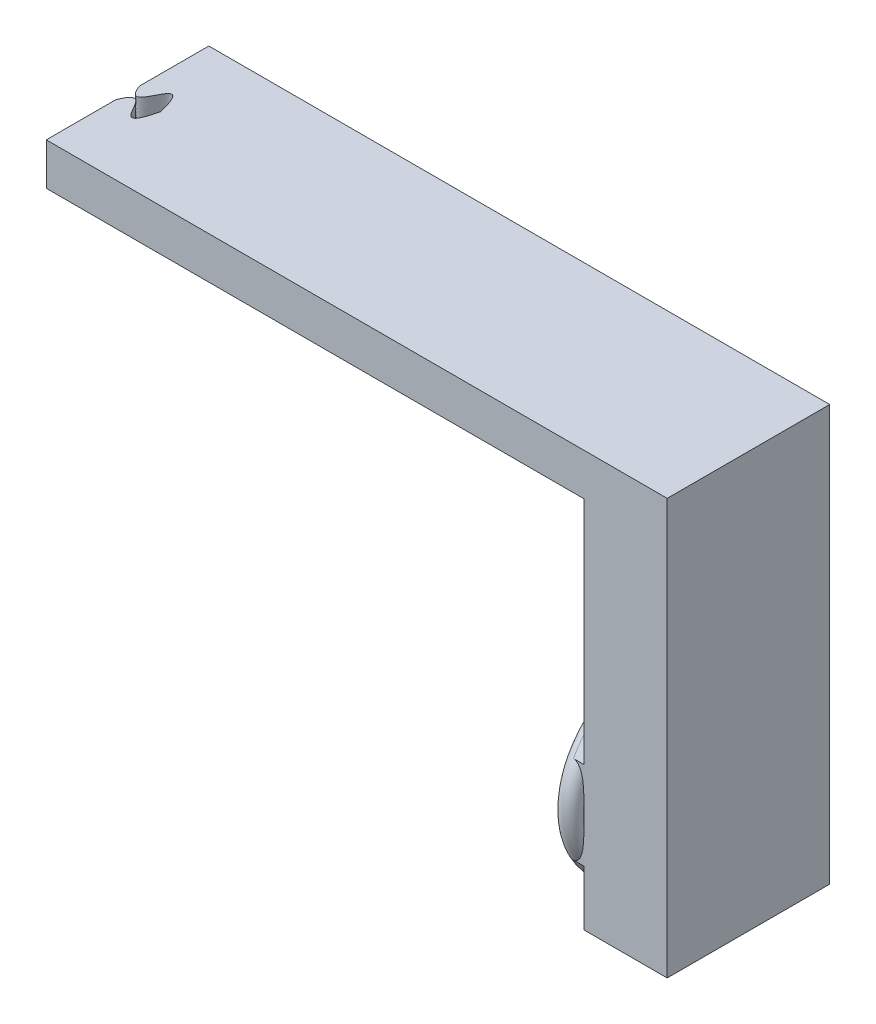
ISO-10303-21;
HEADER;
FILE_DESCRIPTION(('STEP AP214'),'2;1');
FILE_NAME('part.step','',(''),(''),'','','');
FILE_SCHEMA(('AUTOMOTIVE_DESIGN { 1 0 10303 214 1 1 1 1 }'));
ENDSEC;
DATA;
#1=APPLICATION_CONTEXT('core data for automotive mechanical design processes');
#2=APPLICATION_PROTOCOL_DEFINITION('international standard','automotive_design',2000,#1);
#3=PRODUCT_CONTEXT('',#1,'mechanical');
#4=PRODUCT('Part','Part','',(#3));
#5=PRODUCT_RELATED_PRODUCT_CATEGORY('part','',(#4));
#6=PRODUCT_DEFINITION_FORMATION('','',#4);
#7=PRODUCT_DEFINITION_CONTEXT('part definition',#1,'design');
#8=PRODUCT_DEFINITION('design','',#6,#7);
#9=PRODUCT_DEFINITION_SHAPE('','',#8);
#10=(LENGTH_UNIT() NAMED_UNIT(*) SI_UNIT(.MILLI.,.METRE.));
#11=(NAMED_UNIT(*) PLANE_ANGLE_UNIT() SI_UNIT($,.RADIAN.));
#12=(NAMED_UNIT(*) SI_UNIT($,.STERADIAN.) SOLID_ANGLE_UNIT());
#13=UNCERTAINTY_MEASURE_WITH_UNIT(LENGTH_MEASURE(1.E-05),#10,'distance_accuracy_value','');
#14=(GEOMETRIC_REPRESENTATION_CONTEXT(3) GLOBAL_UNCERTAINTY_ASSIGNED_CONTEXT((#13)) GLOBAL_UNIT_ASSIGNED_CONTEXT((#10,
#11,#12)) REPRESENTATION_CONTEXT('',''));
#15=CARTESIAN_POINT('',(0.,0.,0.));
#16=DIRECTION('',(0.,0.,1.));
#17=DIRECTION('',(1.,0.,0.));
#18=AXIS2_PLACEMENT_3D('',#15,#16,#17);
#19=CARTESIAN_POINT('',(122.99867768057,-65.278,-19.3474854195136));
#20=DIRECTION('',(1.,0.,0.));
#21=DIRECTION('',(0.,0.,-1.));
#22=AXIS2_PLACEMENT_3D('',#19,#20,#21);
#23=CYLINDRICAL_SURFACE('',#22,22.);
#24=CARTESIAN_POINT('',(125.49867768057,-65.278,-19.3474854195136));
#25=DIRECTION('',(-1.,0.,0.));
#26=DIRECTION('',(0.,0.,1.));
#27=AXIS2_PLACEMENT_3D('',#24,#25,#26);
#28=CIRCLE('',#27,22.);
#29=CARTESIAN_POINT('',(125.49867768057,-75.7505740838491,0.));
#30=VERTEX_POINT('',#29);
#31=CARTESIAN_POINT('',(125.49867768057,-75.7505740838491,-38.6949708390272));
#32=VERTEX_POINT('',#31);
#33=EDGE_CURVE('E317',#30,#32,#28,.F.);
#34=ORIENTED_EDGE('',*,*,#33,.T.);
#35=DIRECTION('',(1.,0.,0.));
#36=VECTOR('',#35,1.);
#37=CARTESIAN_POINT('',(125.49867768057,-75.7505740838491,-38.6949708390272));
#38=LINE('',#37,#36);
#39=CARTESIAN_POINT('',(127.99867768057,-75.7505740838491,-38.6949708390272));
#40=VERTEX_POINT('',#39);
#41=EDGE_CURVE('E238',#32,#40,#38,.T.);
#42=ORIENTED_EDGE('',*,*,#41,.T.);
#43=CARTESIAN_POINT('',(127.99867768057,-65.278,-19.3474854195136));
#44=DIRECTION('',(1.,0.,0.));
#45=DIRECTION('',(0.,0.,-1.));
#46=AXIS2_PLACEMENT_3D('',#43,#44,#45);
#47=CIRCLE('',#46,22.);
#48=CARTESIAN_POINT('',(127.99867768057,-75.7505740838491,0.));
#49=VERTEX_POINT('',#48);
#50=EDGE_CURVE('E372',#40,#49,#47,.F.);
#51=ORIENTED_EDGE('',*,*,#50,.T.);
#52=DIRECTION('',(1.,0.,0.));
#53=VECTOR('',#52,1.);
#54=CARTESIAN_POINT('',(122.99867768057,-75.7505740838491,0.));
#55=LINE('',#54,#53);
#56=EDGE_CURVE('E320',#49,#30,#55,.F.);
#57=ORIENTED_EDGE('',*,*,#56,.T.);
#58=EDGE_LOOP('',(#34,#42,#51,#57));
#59=FACE_BOUND('',#58,.T.);
#60=ADVANCED_FACE('F35',(#59),#23,.T.);
#61=CARTESIAN_POINT('',(125.49867768057,-65.278,-19.3474854195136));
#62=DIRECTION('',(-1.,0.,0.));
#63=DIRECTION('',(0.,0.,1.));
#64=AXIS2_PLACEMENT_3D('',#61,#62,#63);
#65=TOROIDAL_SURFACE('',#64,19.5,2.50000000000001);
#66=CARTESIAN_POINT('',(122.99867768057,-65.278,-19.3474854195136));
#67=DIRECTION('',(-1.,0.,0.));
#68=DIRECTION('',(0.,0.,1.));
#69=AXIS2_PLACEMENT_3D('',#66,#67,#68);
#70=CIRCLE('',#69,19.5);
#71=CARTESIAN_POINT('',(122.99867768057,-65.278,0.152514580486374));
#72=VERTEX_POINT('',#71);
#73=EDGE_CURVE('E332',#72,#72,#70,.T.);
#74=ORIENTED_EDGE('',*,*,#73,.F.);
#75=EDGE_LOOP('',(#74));
#76=FACE_BOUND('',#75,.T.);
#77=CARTESIAN_POINT('',(127.99867768057,-67.7120928375285,0.));
#78=CARTESIAN_POINT('',(127.998653875089,-67.9150415597241,0.));
#79=CARTESIAN_POINT('',(127.998291756496,-68.1179952993419,0.));
#80=CARTESIAN_POINT('',(127.996150881221,-68.5239263347357,0.));
#81=CARTESIAN_POINT('',(127.994371901966,-68.7269036292026,0.));
#82=CARTESIAN_POINT('',(127.98864102688,-69.1339543891392,0.));
#83=CARTESIAN_POINT('',(127.984677164041,-69.3380277064403,0.));
#84=CARTESIAN_POINT('',(127.973638455801,-69.7460832746379,0.));
#85=CARTESIAN_POINT('',(127.966563786721,-69.9500655300399,0.));
#86=CARTESIAN_POINT('',(127.947739638931,-70.3686750733143,0.));
#87=CARTESIAN_POINT('',(127.935761919262,-70.5832925844783,0.));
#88=CARTESIAN_POINT('',(127.905675866098,-71.0120938799854,0.));
#89=CARTESIAN_POINT('',(127.887568106465,-71.2262777030407,0.));
#90=CARTESIAN_POINT('',(127.843482552317,-71.6533605381168,0.));
#91=CARTESIAN_POINT('',(127.817522817748,-71.8662613669498,0.));
#92=CARTESIAN_POINT('',(127.755547244861,-72.2905685407659,0.));
#93=CARTESIAN_POINT('',(127.719535134195,-72.5019754100053,0.));
#94=CARTESIAN_POINT('',(127.647207862933,-72.8600822586272,0.));
#95=CARTESIAN_POINT('',(127.614130776684,-73.007432034874,0.));
#96=CARTESIAN_POINT('',(127.540336247468,-73.3003183086709,0.));
#97=CARTESIAN_POINT('',(127.499614843539,-73.4458538242689,0.));
#98=CARTESIAN_POINT('',(127.40943877384,-73.73272579543,0.));
#99=CARTESIAN_POINT('',(127.360069958055,-73.8740888871132,0.));
#100=CARTESIAN_POINT('',(127.250490719176,-74.1524902276336,0.));
#101=CARTESIAN_POINT('',(127.1902902972,-74.2895323301195,0.));
#102=CARTESIAN_POINT('',(127.067337109229,-74.5355576574483,0.));
#103=CARTESIAN_POINT('',(127.006548391876,-74.6455114548854,0.));
#104=CARTESIAN_POINT('',(126.873595270829,-74.8588601007675,0.));
#105=CARTESIAN_POINT('',(126.801401458554,-74.9622369960858,0.));
#106=CARTESIAN_POINT('',(126.642661111286,-75.1597761133722,0.));
#107=CARTESIAN_POINT('',(126.555939831606,-75.253800730244,0.));
#108=CARTESIAN_POINT('',(126.366939703951,-75.4246246211576,0.));
#109=CARTESIAN_POINT('',(126.264733806815,-75.5015006929473,0.));
#110=CARTESIAN_POINT('',(126.091146127673,-75.6020871227989,0.));
#111=CARTESIAN_POINT('',(126.024848187066,-75.6345659654067,0.));
#112=CARTESIAN_POINT('',(125.887915704172,-75.6884599040057,0.));
#113=CARTESIAN_POINT('',(125.817290872627,-75.7098988273357,0.));
#114=CARTESIAN_POINT('',(125.709299324383,-75.7324512271571,0.));
#115=CARTESIAN_POINT('',(125.672889661776,-75.7383697164854,0.));
#116=CARTESIAN_POINT('',(125.599670085356,-75.7468513411134,0.));
#117=CARTESIAN_POINT('',(125.562860168975,-75.7494144548812,0.));
#118=CARTESIAN_POINT('',(125.488820831862,-75.7511137235701,0.));
#119=CARTESIAN_POINT('',(125.451590693735,-75.7502177820609,0.));
#120=CARTESIAN_POINT('',(125.377360999609,-75.7449704281656,0.));
#121=CARTESIAN_POINT('',(125.340361530857,-75.7406177798349,0.));
#122=CARTESIAN_POINT('',(125.303645281954,-75.7345588957656,0.));
#123=B_SPLINE_CURVE_WITH_KNOTS('',3,(#77,#78,#79,#80,#81,#82,#83,#84,#85,#86,#87,#88,#89,#90,
#91,#92,#93,#94,#95,#96,#97,#98,#99,#100,#101,#102,#103,#104,#105,#106,#107,#108,#109,#110,#111,
#112,#113,#114,#115,#116,#117,#118,#119,#120,#121,#122),.UNSPECIFIED.,.F.,.F.,(4,2,2,2,2,2,2,2,
2,2,2,2,2,2,2,2,2,2,2,2,2,2,4),(0.,0.608853777534797,1.21780321725812,1.83012161295994,
2.442405307144,3.08719445794953,3.73192326359535,4.37518029298062,5.01819910394352,
5.47108862725286,5.92421346974392,6.37307134585034,6.82151688633855,7.19791275577215,
7.57529551632987,7.95759514581978,8.3381466936341,8.55886071683672,8.77909635743805,
8.88962879393999,9.00016193973422,9.1117231719602,9.22332431084367),.UNSPECIFIED.);
#124=CARTESIAN_POINT('',(127.99867768057,-67.7120928375285,0.));
#125=VERTEX_POINT('',#124);
#126=EDGE_CURVE('E241',#125,#30,#123,.T.);
#127=ORIENTED_EDGE('',*,*,#126,.F.);
#128=CARTESIAN_POINT('',(127.99867768057,-65.278,-19.3474854195136));
#129=DIRECTION('',(-1.,0.,0.));
#130=DIRECTION('',(0.,0.,1.));
#131=AXIS2_PLACEMENT_3D('',#128,#129,#130);
#132=CIRCLE('',#131,19.5);
#133=CARTESIAN_POINT('',(127.99867768057,-62.8439071624715,0.));
#134=VERTEX_POINT('',#133);
#135=EDGE_CURVE('E330',#134,#125,#132,.F.);
#136=ORIENTED_EDGE('',*,*,#135,.F.);
#137=CARTESIAN_POINT('',(127.99867768057,-62.8439071624715,0.));
#138=CARTESIAN_POINT('',(127.998653875089,-62.6409584402759,0.));
#139=CARTESIAN_POINT('',(127.998291756496,-62.4380047006581,0.));
#140=CARTESIAN_POINT('',(127.996150881221,-62.0320736652643,0.));
#141=CARTESIAN_POINT('',(127.994371901966,-61.8290963707974,0.));
#142=CARTESIAN_POINT('',(127.98864102688,-61.4220456108608,0.));
#143=CARTESIAN_POINT('',(127.984677164041,-61.2179722935597,0.));
#144=CARTESIAN_POINT('',(127.973638455801,-60.8099167253621,0.));
#145=CARTESIAN_POINT('',(127.966563786721,-60.6059344699601,0.));
#146=CARTESIAN_POINT('',(127.947739638931,-60.1873249266857,0.));
#147=CARTESIAN_POINT('',(127.935761919262,-59.9727074155216,0.));
#148=CARTESIAN_POINT('',(127.905675866098,-59.5439061200146,0.));
#149=CARTESIAN_POINT('',(127.887568106465,-59.3297222969593,0.));
#150=CARTESIAN_POINT('',(127.843482552317,-58.9026394618831,0.));
#151=CARTESIAN_POINT('',(127.817522817748,-58.6897386330502,0.));
#152=CARTESIAN_POINT('',(127.755547244861,-58.2654314592341,0.));
#153=CARTESIAN_POINT('',(127.719535134195,-58.0540245899947,0.));
#154=CARTESIAN_POINT('',(127.647207862933,-57.6959177413727,0.));
#155=CARTESIAN_POINT('',(127.614130776684,-57.548567965126,0.));
#156=CARTESIAN_POINT('',(127.540336247468,-57.2556816913291,0.));
#157=CARTESIAN_POINT('',(127.499614843539,-57.1101461757311,0.));
#158=CARTESIAN_POINT('',(127.40943877384,-56.82327420457,0.));
#159=CARTESIAN_POINT('',(127.360069958055,-56.6819111128868,0.));
#160=CARTESIAN_POINT('',(127.250490719176,-56.4035097723663,0.));
#161=CARTESIAN_POINT('',(127.1902902972,-56.2664676698805,0.));
#162=CARTESIAN_POINT('',(127.067337109229,-56.0204423425517,0.));
#163=CARTESIAN_POINT('',(127.006548391876,-55.9104885451145,0.));
#164=CARTESIAN_POINT('',(126.873595270829,-55.6971398992325,0.));
#165=CARTESIAN_POINT('',(126.801401458554,-55.5937630039142,0.));
#166=CARTESIAN_POINT('',(126.642661111286,-55.3962238866277,0.));
#167=CARTESIAN_POINT('',(126.555939831606,-55.3021992697559,0.));
#168=CARTESIAN_POINT('',(126.366939703951,-55.1313753788423,0.));
#169=CARTESIAN_POINT('',(126.264733806815,-55.0544993070527,0.));
#170=CARTESIAN_POINT('',(126.091146127673,-54.9539128772011,0.));
#171=CARTESIAN_POINT('',(126.024848187066,-54.9214340345932,0.));
#172=CARTESIAN_POINT('',(125.887915704172,-54.8675400959942,0.));
#173=CARTESIAN_POINT('',(125.817290872627,-54.8461011726643,0.));
#174=CARTESIAN_POINT('',(125.709299324383,-54.8235487728429,0.));
#175=CARTESIAN_POINT('',(125.672889661776,-54.8176302835145,0.));
#176=CARTESIAN_POINT('',(125.599670085356,-54.8091486588866,0.));
#177=CARTESIAN_POINT('',(125.562860168975,-54.8065855451188,0.));
#178=CARTESIAN_POINT('',(125.488820831862,-54.8048862764299,0.));
#179=CARTESIAN_POINT('',(125.451590693735,-54.8057822179391,0.));
#180=CARTESIAN_POINT('',(125.377360999609,-54.8110295718344,0.));
#181=CARTESIAN_POINT('',(125.340361530857,-54.815382220165,0.));
#182=CARTESIAN_POINT('',(125.303645281954,-54.8214411042344,0.));
#183=B_SPLINE_CURVE_WITH_KNOTS('',3,(#137,#138,#139,#140,#141,#142,#143,#144,#145,#146,#147,
#148,#149,#150,#151,#152,#153,#154,#155,#156,#157,#158,#159,#160,#161,#162,#163,#164,#165,#166,
#167,#168,#169,#170,#171,#172,#173,#174,#175,#176,#177,#178,#179,#180,#181,#182),.UNSPECIFIED.,
.F.,.F.,(4,2,2,2,2,2,2,2,2,2,2,2,2,2,2,2,2,2,2,2,2,2,4),(0.,0.608853777534783,1.2178032172581,
1.83012161295994,2.44240530714399,3.08719445794953,3.73192326359537,4.37518029298064,
5.01819910394352,5.47108862725284,5.92421346974392,6.37307134585034,6.82151688633855,
7.19791275577218,7.5752955163299,7.95759514581982,8.33814669363414,8.55886071683678,
8.77909635743809,8.88962879394004,9.00016193973427,9.11172317196024,9.22332431084372),.UNSPECIFIED.);
#184=CARTESIAN_POINT('',(125.49867768057,-54.8054259161509,0.));
#185=VERTEX_POINT('',#184);
#186=EDGE_CURVE('E246',#185,#134,#183,.F.);
#187=ORIENTED_EDGE('',*,*,#186,.F.);
#188=CARTESIAN_POINT('',(125.49867768057,-54.8054259161509,-38.6949708390272));
#189=VERTEX_POINT('',#188);
#190=EDGE_CURVE('E318',#189,#185,#28,.F.);
#191=ORIENTED_EDGE('',*,*,#190,.F.);
#192=EDGE_CURVE('E314',#32,#189,#28,.F.);
#193=ORIENTED_EDGE('',*,*,#192,.F.);
#194=ORIENTED_EDGE('',*,*,#33,.F.);
#195=EDGE_LOOP('',(#127,#136,#187,#191,#193,#194));
#196=FACE_BOUND('',#195,.T.);
#197=ADVANCED_FACE('F254',(#76,#196),#65,.T.);
#198=CARTESIAN_POINT('',(127.99867768057,-88.9,-38.6949708390272));
#199=DIRECTION('',(1.,0.,0.));
#200=DIRECTION('',(0.,0.,-1.));
#201=AXIS2_PLACEMENT_3D('',#198,#199,#200);
#202=PLANE('',#201);
#203=ORIENTED_EDGE('',*,*,#50,.F.);
#204=DIRECTION('',(0.,1.,0.));
#205=VECTOR('',#204,1.);
#206=CARTESIAN_POINT('',(127.99867768057,-88.9,-38.6949708390272));
#207=LINE('',#206,#205);
#208=CARTESIAN_POINT('',(127.99867768057,-88.9,-38.6949708390272));
#209=VERTEX_POINT('',#208);
#210=EDGE_CURVE('E184',#209,#40,#207,.T.);
#211=ORIENTED_EDGE('',*,*,#210,.F.);
#212=DIRECTION('',(0.,0.,-1.));
#213=VECTOR('',#212,1.);
#214=CARTESIAN_POINT('',(127.99867768057,-88.9,-38.6949708390272));
#215=LINE('',#214,#213);
#216=CARTESIAN_POINT('',(127.99867768057,-88.9,0.));
#217=VERTEX_POINT('',#216);
#218=EDGE_CURVE('E167',#217,#209,#215,.T.);
#219=ORIENTED_EDGE('',*,*,#218,.F.);
#220=DIRECTION('',(0.,1.,0.));
#221=VECTOR('',#220,1.);
#222=CARTESIAN_POINT('',(127.99867768057,-88.9,0.));
#223=LINE('',#222,#221);
#224=EDGE_CURVE('E164',#217,#49,#223,.T.);
#225=ORIENTED_EDGE('',*,*,#224,.T.);
#226=EDGE_LOOP('',(#203,#211,#219,#225));
#227=FACE_BOUND('',#226,.T.);
#228=ADVANCED_FACE('F259',(#227),#202,.F.);
#229=CARTESIAN_POINT('',(4.03479205143796,0.,-16.5536165521471));
#230=DIRECTION('',(0.,1.,0.));
#231=DIRECTION('',(0.,0.,1.));
#232=AXIS2_PLACEMENT_3D('',#229,#230,#231);
#233=PLANE('',#232);
#234=DIRECTION('',(0.,0.,-1.));
#235=VECTOR('',#234,1.);
#236=CARTESIAN_POINT('',(127.99867768057,0.,-38.6949708390272));
#237=LINE('',#236,#235);
#238=CARTESIAN_POINT('',(127.99867768057,0.,0.));
#239=VERTEX_POINT('',#238);
#240=CARTESIAN_POINT('',(127.99867768057,0.,-38.6949708390272));
#241=VERTEX_POINT('',#240);
#242=EDGE_CURVE('E173',#239,#241,#237,.T.);
#243=ORIENTED_EDGE('',*,*,#242,.F.);
#244=DIRECTION('',(1.,0.,0.));
#245=VECTOR('',#244,1.);
#246=CARTESIAN_POINT('',(0.,0.,0.));
#247=LINE('',#246,#245);
#248=CARTESIAN_POINT('',(0.,0.,0.));
#249=VERTEX_POINT('',#248);
#250=EDGE_CURVE('E335',#249,#239,#247,.T.);
#251=ORIENTED_EDGE('',*,*,#250,.F.);
#252=DIRECTION('',(0.,0.,1.));
#253=VECTOR('',#252,1.);
#254=CARTESIAN_POINT('',(0.,0.,0.));
#255=LINE('',#254,#253);
#256=CARTESIAN_POINT('',(0.,0.,-16.5121344341374));
#257=VERTEX_POINT('',#256);
#258=EDGE_CURVE('E190',#257,#249,#255,.T.);
#259=ORIENTED_EDGE('',*,*,#258,.F.);
#260=CARTESIAN_POINT('',(7.81240542852166,0.,-19.3474854195136));
#261=CARTESIAN_POINT('',(4.76655386816981,0.,-6.63526012811717));
#262=CARTESIAN_POINT('',(3.38875645949087,0.,-25.5545107263915));
#263=CARTESIAN_POINT('',(0.,0.,-16.5121344341374));
#264=B_SPLINE_CURVE_WITH_KNOTS('',3,(#260,#261,#262,#263),.UNSPECIFIED.,.F.,.F.,(4,4),(0.,1.),.UNSPECIFIED.);
#265=CARTESIAN_POINT('',(7.81240542852166,0.,-19.3474854195136));
#266=VERTEX_POINT('',#265);
#267=EDGE_CURVE('E196',#266,#257,#264,.T.);
#268=ORIENTED_EDGE('',*,*,#267,.F.);
#269=CARTESIAN_POINT('',(0.,0.,-22.1828364048899));
#270=CARTESIAN_POINT('',(3.38875645949086,0.,-13.1404601126358));
#271=CARTESIAN_POINT('',(4.5622347186891,0.,-33.0604951188177));
#272=CARTESIAN_POINT('',(7.81240542852166,0.,-19.3474854195136));
#273=B_SPLINE_CURVE_WITH_KNOTS('',3,(#269,#270,#271,#272),.UNSPECIFIED.,.F.,.F.,(4,4),(0.,1.),.UNSPECIFIED.);
#274=CARTESIAN_POINT('',(0.,0.,-22.1828364048899));
#275=VERTEX_POINT('',#274);
#276=EDGE_CURVE('E345',#275,#266,#273,.T.);
#277=ORIENTED_EDGE('',*,*,#276,.F.);
#278=DIRECTION('',(0.,0.,1.));
#279=VECTOR('',#278,1.);
#280=CARTESIAN_POINT('',(0.,0.,-22.1828364048899));
#281=LINE('',#280,#279);
#282=CARTESIAN_POINT('',(0.,0.,-38.6949708390272));
#283=VERTEX_POINT('',#282);
#284=EDGE_CURVE('E341',#283,#275,#281,.T.);
#285=ORIENTED_EDGE('',*,*,#284,.F.);
#286=DIRECTION('',(-1.,0.,0.));
#287=VECTOR('',#286,1.);
#288=CARTESIAN_POINT('',(0.,0.,-38.6949708390272));
#289=LINE('',#288,#287);
#290=EDGE_CURVE('E338',#241,#283,#289,.T.);
#291=ORIENTED_EDGE('',*,*,#290,.F.);
#292=EDGE_LOOP('',(#243,#251,#259,#268,#277,#285,#291));
#293=FACE_BOUND('',#292,.T.);
#294=ADVANCED_FACE('F264',(#293),#233,.F.);
#295=CARTESIAN_POINT('',(0.,10.,0.));
#296=DIRECTION('',(1.,0.,0.));
#297=DIRECTION('',(0.,0.,-1.));
#298=AXIS2_PLACEMENT_3D('',#295,#296,#297);
#299=PLANE('',#298);
#300=ORIENTED_EDGE('',*,*,#258,.T.);
#301=DIRECTION('',(0.,-1.,0.));
#302=VECTOR('',#301,1.);
#303=CARTESIAN_POINT('',(0.,10.,0.));
#304=LINE('',#303,#302);
#305=CARTESIAN_POINT('',(0.,10.,0.));
#306=VERTEX_POINT('',#305);
#307=EDGE_CURVE('E156',#306,#249,#304,.T.);
#308=ORIENTED_EDGE('',*,*,#307,.F.);
#309=DIRECTION('',(0.,0.,1.));
#310=VECTOR('',#309,1.);
#311=CARTESIAN_POINT('',(0.,10.,0.));
#312=LINE('',#311,#310);
#313=CARTESIAN_POINT('',(0.,10.,-16.5121344341374));
#314=VERTEX_POINT('',#313);
#315=EDGE_CURVE('E192',#314,#306,#312,.T.);
#316=ORIENTED_EDGE('',*,*,#315,.F.);
#317=DIRECTION('',(0.,-1.,0.));
#318=VECTOR('',#317,1.);
#319=CARTESIAN_POINT('',(0.,10.,-16.5121344341374));
#320=LINE('',#319,#318);
#321=EDGE_CURVE('E355',#314,#257,#320,.T.);
#322=ORIENTED_EDGE('',*,*,#321,.T.);
#323=EDGE_LOOP('',(#300,#308,#316,#322));
#324=FACE_BOUND('',#323,.T.);
#325=ADVANCED_FACE('F261',(#324),#299,.F.);
#326=CARTESIAN_POINT('',(0.,10.,0.));
#327=DIRECTION('',(0.,0.,-1.));
#328=DIRECTION('',(-1.,0.,0.));
#329=AXIS2_PLACEMENT_3D('',#326,#327,#328);
#330=PLANE('',#329);
#331=ORIENTED_EDGE('',*,*,#250,.T.);
#332=CARTESIAN_POINT('',(127.99867768057,-54.8054259161509,0.));
#333=VERTEX_POINT('',#332);
#334=EDGE_CURVE('E187',#333,#239,#223,.T.);
#335=ORIENTED_EDGE('',*,*,#334,.F.);
#336=DIRECTION('',(1.,0.,0.));
#337=VECTOR('',#336,1.);
#338=CARTESIAN_POINT('',(122.99867768057,-54.8054259161509,0.));
#339=LINE('',#338,#337);
#340=EDGE_CURVE('E302',#185,#333,#339,.T.);
#341=ORIENTED_EDGE('',*,*,#340,.F.);
#342=ORIENTED_EDGE('',*,*,#186,.T.);
#343=EDGE_CURVE('E191',#125,#134,#223,.T.);
#344=ORIENTED_EDGE('',*,*,#343,.F.);
#345=ORIENTED_EDGE('',*,*,#126,.T.);
#346=ORIENTED_EDGE('',*,*,#56,.F.);
#347=ORIENTED_EDGE('',*,*,#224,.F.);
#348=DIRECTION('',(-1.,0.,0.));
#349=VECTOR('',#348,1.);
#350=CARTESIAN_POINT('',(147.830868252527,-88.9,0.));
#351=LINE('',#350,#349);
#352=CARTESIAN_POINT('',(147.830868252527,-88.9,0.));
#353=VERTEX_POINT('',#352);
#354=EDGE_CURVE('E160',#353,#217,#351,.T.);
#355=ORIENTED_EDGE('',*,*,#354,.F.);
#356=DIRECTION('',(0.,-1.,0.));
#357=VECTOR('',#356,1.);
#358=CARTESIAN_POINT('',(147.830868252527,10.,0.));
#359=LINE('',#358,#357);
#360=CARTESIAN_POINT('',(147.830868252527,10.,0.));
#361=VERTEX_POINT('',#360);
#362=EDGE_CURVE('E148',#361,#353,#359,.T.);
#363=ORIENTED_EDGE('',*,*,#362,.F.);
#364=DIRECTION('',(1.,0.,0.));
#365=VECTOR('',#364,1.);
#366=CARTESIAN_POINT('',(0.,10.,0.));
#367=LINE('',#366,#365);
#368=EDGE_CURVE('E195',#306,#361,#367,.T.);
#369=ORIENTED_EDGE('',*,*,#368,.F.);
#370=ORIENTED_EDGE('',*,*,#307,.T.);
#371=EDGE_LOOP('',(#331,#335,#341,#342,#344,#345,#346,#347,#355,#363,#369,#370));
#372=FACE_BOUND('',#371,.T.);
#373=ADVANCED_FACE('F162',(#372),#330,.F.);
#374=CARTESIAN_POINT('',(147.830868252527,10.,0.));
#375=DIRECTION('',(-1.,0.,0.));
#376=DIRECTION('',(0.,0.,1.));
#377=AXIS2_PLACEMENT_3D('',#374,#375,#376);
#378=PLANE('',#377);
#379=ORIENTED_EDGE('',*,*,#362,.T.);
#380=DIRECTION('',(0.,0.,1.));
#381=VECTOR('',#380,1.);
#382=CARTESIAN_POINT('',(147.830868252527,-88.9,-38.6949708390272));
#383=LINE('',#382,#381);
#384=CARTESIAN_POINT('',(147.830868252527,-88.9,-38.6949708390272));
#385=VERTEX_POINT('',#384);
#386=EDGE_CURVE('E153',#385,#353,#383,.T.);
#387=ORIENTED_EDGE('',*,*,#386,.F.);
#388=DIRECTION('',(0.,-1.,0.));
#389=VECTOR('',#388,1.);
#390=CARTESIAN_POINT('',(147.830868252527,10.,-38.6949708390272));
#391=LINE('',#390,#389);
#392=CARTESIAN_POINT('',(147.830868252527,10.,-38.6949708390272));
#393=VERTEX_POINT('',#392);
#394=EDGE_CURVE('E157',#393,#385,#391,.T.);
#395=ORIENTED_EDGE('',*,*,#394,.F.);
#396=DIRECTION('',(0.,0.,-1.));
#397=VECTOR('',#396,1.);
#398=CARTESIAN_POINT('',(147.830868252527,10.,0.));
#399=LINE('',#398,#397);
#400=EDGE_CURVE('E154',#361,#393,#399,.T.);
#401=ORIENTED_EDGE('',*,*,#400,.F.);
#402=EDGE_LOOP('',(#379,#387,#395,#401));
#403=FACE_BOUND('',#402,.T.);
#404=ADVANCED_FACE('F150',(#403),#378,.F.);
#405=CARTESIAN_POINT('',(0.,10.,-38.6949708390272));
#406=DIRECTION('',(0.,0.,1.));
#407=DIRECTION('',(1.,0.,0.));
#408=AXIS2_PLACEMENT_3D('',#405,#406,#407);
#409=PLANE('',#408);
#410=ORIENTED_EDGE('',*,*,#394,.T.);
#411=DIRECTION('',(1.,0.,0.));
#412=VECTOR('',#411,1.);
#413=CARTESIAN_POINT('',(147.830868252527,-88.9,-38.6949708390272));
#414=LINE('',#413,#412);
#415=EDGE_CURVE('E172',#209,#385,#414,.T.);
#416=ORIENTED_EDGE('',*,*,#415,.F.);
#417=ORIENTED_EDGE('',*,*,#210,.T.);
#418=ORIENTED_EDGE('',*,*,#41,.F.);
#419=CARTESIAN_POINT('',(125.49867768057,-75.7505740838491,-38.6949708390272));
#420=CARTESIAN_POINT('',(125.534549779496,-75.750582122027,-38.6949708390272));
#421=CARTESIAN_POINT('',(125.570401633384,-75.7489507685967,-38.6949708390272));
#422=CARTESIAN_POINT('',(125.641787403858,-75.7424956002043,-38.6949708390272));
#423=CARTESIAN_POINT('',(125.677321561618,-75.7376744606843,-38.6949708390272));
#424=CARTESIAN_POINT('',(125.782447175556,-75.7186734640978,-38.6949708390272));
#425=CARTESIAN_POINT('',(125.851257313316,-75.6999523673463,-38.6949708390272));
#426=CARTESIAN_POINT('',(125.984750554884,-75.6519779706656,-38.6949708390272));
#427=CARTESIAN_POINT('',(126.049445539526,-75.6227567771662,-38.6949708390272));
#428=CARTESIAN_POINT('',(126.174274575371,-75.5556181105189,-38.6949708390272));
#429=CARTESIAN_POINT('',(126.234397250177,-75.5176798336192,-38.6949708390272));
#430=CARTESIAN_POINT('',(126.389855710778,-75.40612148743,-38.6949708390272));
#431=CARTESIAN_POINT('',(126.480552230527,-75.3260530019024,-38.6949708390272));
#432=CARTESIAN_POINT('',(126.648640480711,-75.1530245793347,-38.6949708390272));
#433=CARTESIAN_POINT('',(126.72599442004,-75.0600293301659,-38.6949708390272));
#434=CARTESIAN_POINT('',(126.86114799803,-74.8764180956275,-38.6949708390272));
#435=CARTESIAN_POINT('',(126.920164798004,-74.7866816063686,-38.6949708390272));
#436=CARTESIAN_POINT('',(127.030322147936,-74.6024507225602,-38.6949708390272));
#437=CARTESIAN_POINT('',(127.08145602131,-74.5079523837762,-38.6949708390272));
#438=CARTESIAN_POINT('',(127.176976090986,-74.3154438540108,-38.6949708390272));
#439=CARTESIAN_POINT('',(127.221350853611,-74.2174280514134,-38.6949708390272));
#440=CARTESIAN_POINT('',(127.304163460054,-74.0189854012458,-38.6949708390272));
#441=CARTESIAN_POINT('',(127.342603375989,-73.918559409394,-38.6949708390272));
#442=CARTESIAN_POINT('',(127.429988363095,-73.6717361746194,-38.6949708390272));
#443=CARTESIAN_POINT('',(127.476211071507,-73.5243776166747,-38.6949708390272));
#444=CARTESIAN_POINT('',(127.55995089425,-73.2271786700544,-38.6949708390272));
#445=CARTESIAN_POINT('',(127.597463626619,-73.0773370726064,-38.6949708390272));
#446=CARTESIAN_POINT('',(127.665277661257,-72.775779118755,-38.6949708390272));
#447=CARTESIAN_POINT('',(127.695566439824,-72.6240599793793,-38.6949708390272));
#448=CARTESIAN_POINT('',(127.750043276998,-72.319517772954,-38.6949708390272));
#449=CARTESIAN_POINT('',(127.774230201472,-72.1666945061052,-38.6949708390272));
#450=CARTESIAN_POINT('',(127.817620827183,-71.8593442669506,-38.6949708390272));
#451=CARTESIAN_POINT('',(127.836791306427,-71.7048126673435,-38.6949708390272));
#452=CARTESIAN_POINT('',(127.870783919317,-71.3952670367557,-38.6949708390272));
#453=CARTESIAN_POINT('',(127.88560566876,-71.2402529643714,-38.6949708390272));
#454=CARTESIAN_POINT('',(127.92463283494,-70.7750823672333,-38.6949708390272));
#455=CARTESIAN_POINT('',(127.943442454068,-70.4644743808994,-38.6949708390272));
#456=CARTESIAN_POINT('',(127.966607408522,-69.9489380335278,-38.6949708390272));
#457=CARTESIAN_POINT('',(127.97370477095,-69.744111522782,-38.6949708390272));
#458=CARTESIAN_POINT('',(127.984763776684,-69.3343394492265,-38.6949708390272));
#459=CARTESIAN_POINT('',(127.988724918896,-69.1293938726257,-38.6949708390272));
#460=CARTESIAN_POINT('',(127.994415776785,-68.7223661576318,-38.6949708390272));
#461=CARTESIAN_POINT('',(127.996176155567,-68.5202843728108,-38.6949708390272));
#462=CARTESIAN_POINT('',(127.998295433189,-68.1161646414449,-38.6949708390272));
#463=CARTESIAN_POINT('',(127.998654692729,-67.9141266970082,-38.6949708390272));
#464=CARTESIAN_POINT('',(127.99867768057,-67.7120928375286,-38.6949708390272));
#465=B_SPLINE_CURVE_WITH_KNOTS('',3,(#419,#420,#421,#422,#423,#424,#425,#426,#427,#428,#429,
#430,#431,#432,#433,#434,#435,#436,#437,#438,#439,#440,#441,#442,#443,#444,#445,#446,#447,#448,
#449,#450,#451,#452,#453,#454,#455,#456,#457,#458,#459,#460,#461,#462,#463,#464),.UNSPECIFIED.,
.F.,.F.,(4,2,2,2,2,2,2,2,2,2,2,2,2,2,2,2,2,2,2,2,2,2,4),(0.,0.107541316419669,0.214992546409544,
0.427837884615496,0.640037862036771,0.852749624299247,1.21361053522845,1.57547732716521,
1.89722051824507,2.21923473570239,2.54178776169806,2.86422791420229,3.32718660942119,
3.79037771550438,4.25436608225676,4.71844062568878,5.18551493179395,5.65263049059058,
6.58588519246215,7.20071732555033,7.81564767460557,8.42191112999403,9.02801850043509),.UNSPECIFIED.);
#466=CARTESIAN_POINT('',(127.99867768057,-67.7120928375286,-38.6949708390272));
#467=VERTEX_POINT('',#466);
#468=EDGE_CURVE('E48',#32,#467,#465,.T.);
#469=ORIENTED_EDGE('',*,*,#468,.T.);
#470=CARTESIAN_POINT('',(127.99867768057,-62.8439071624714,-38.6949708390272));
#471=VERTEX_POINT('',#470);
#472=EDGE_CURVE('E188',#467,#471,#207,.T.);
#473=ORIENTED_EDGE('',*,*,#472,.T.);
#474=CARTESIAN_POINT('',(127.99867768057,-62.8439071624714,-38.6949708390272));
#475=CARTESIAN_POINT('',(127.998651209059,-62.6355686210914,-38.6949708390272));
#476=CARTESIAN_POINT('',(127.998270920503,-62.4272243628134,-38.6949708390272));
#477=CARTESIAN_POINT('',(127.99599711209,-62.0105076535688,-38.6949708390272));
#478=CARTESIAN_POINT('',(127.994103320431,-61.8021352042604,-38.6949708390272));
#479=CARTESIAN_POINT('',(127.987979406295,-61.3842647764748,-38.6949708390272));
#480=CARTESIAN_POINT('',(127.983736386025,-61.1747669643183,-38.6949708390272));
#481=CARTESIAN_POINT('',(127.971888608942,-60.7558747662593,-38.6949708390272));
#482=CARTESIAN_POINT('',(127.964284078401,-60.546480374345,-38.6949708390272));
#483=CARTESIAN_POINT('',(127.944530532892,-60.1279150590991,-38.6949708390272));
#484=CARTESIAN_POINT('',(127.932381907284,-59.9187441181607,-38.6949708390272));
#485=CARTESIAN_POINT('',(127.902141163441,-59.5008359390425,-38.6949708390272));
#486=CARTESIAN_POINT('',(127.884049599969,-59.2920986622105,-38.6949708390272));
#487=CARTESIAN_POINT('',(127.840292928322,-58.8758614313773,-38.6949708390272));
#488=CARTESIAN_POINT('',(127.814644404318,-58.6683597725349,-38.6949708390272));
#489=CARTESIAN_POINT('',(127.753729539051,-58.2547958175984,-38.6949708390272));
#490=CARTESIAN_POINT('',(127.718466774854,-58.0487330153514,-38.6949708390272));
#491=CARTESIAN_POINT('',(127.658097441181,-57.749835109273,-38.6949708390272));
#492=CARTESIAN_POINT('',(127.637809324532,-57.6560239738247,-38.6949708390272));
#493=CARTESIAN_POINT('',(127.59433671634,-57.4690648896274,-38.6949708390272));
#494=CARTESIAN_POINT('',(127.571151771753,-57.3759170470269,-38.6949708390272));
#495=CARTESIAN_POINT('',(127.496494833577,-57.0967700539494,-38.6949708390272));
#496=CARTESIAN_POINT('',(127.440105145168,-56.9120176854166,-38.6949708390272));
#497=CARTESIAN_POINT('',(127.332340932119,-56.6090330928541,-38.6949708390272));
#498=CARTESIAN_POINT('',(127.285566478334,-56.4891664361027,-38.6949708390272));
#499=CARTESIAN_POINT('',(127.183226795521,-56.2530622997032,-38.6949708390272));
#500=CARTESIAN_POINT('',(127.127654273101,-56.1368279277102,-38.6949708390272));
#501=CARTESIAN_POINT('',(127.006522423905,-55.9107226442497,-38.6949708390272));
#502=CARTESIAN_POINT('',(126.941040376585,-55.8008108648504,-38.6949708390272));
#503=CARTESIAN_POINT('',(126.797886835702,-55.5893546672709,-38.6949708390272));
#504=CARTESIAN_POINT('',(126.720243490582,-55.4877917327285,-38.6949708390272));
#505=CARTESIAN_POINT('',(126.576086711213,-55.3260572840876,-38.6949708390272));
#506=CARTESIAN_POINT('',(126.513255697102,-55.2626275239336,-38.6949708390272));
#507=CARTESIAN_POINT('',(126.379818914664,-55.1442484098848,-38.6949708390272));
#508=CARTESIAN_POINT('',(126.30920652231,-55.0893063783608,-38.6949708390272));
#509=CARTESIAN_POINT('',(126.159138368199,-54.9904685039199,-38.6949708390272));
#510=CARTESIAN_POINT('',(126.079578163253,-54.9467280692442,-38.6949708390272));
#511=CARTESIAN_POINT('',(125.913616628971,-54.8753856492539,-38.6949708390272));
#512=CARTESIAN_POINT('',(125.827244118599,-54.8477194268784,-38.6949708390272));
#513=CARTESIAN_POINT('',(125.699507763388,-54.8217363385426,-38.6949708390272));
#514=CARTESIAN_POINT('',(125.659639053034,-54.8156491599801,-38.6949708390272));
#515=CARTESIAN_POINT('',(125.579417543355,-54.8074849613201,-38.6949708390272));
#516=CARTESIAN_POINT('',(125.539063963836,-54.8054156353546,-38.6949708390272));
#517=CARTESIAN_POINT('',(125.49867768057,-54.8054259161509,-38.6949708390272));
#518=B_SPLINE_CURVE_WITH_KNOTS('',3,(#474,#475,#476,#477,#478,#479,#480,#481,#482,#483,#484,
#485,#486,#487,#488,#489,#490,#491,#492,#493,#494,#495,#496,#497,#498,#499,#500,#501,#502,#503,
#504,#505,#506,#507,#508,#509,#510,#511,#512,#513,#514,#515,#516,#517),.UNSPECIFIED.,.F.,.F.,(4,
2,2,2,2,2,2,2,2,2,2,2,2,2,2,2,2,2,2,2,2,4),(0.,0.625024348670387,1.25016096794977,
1.87876425828466,2.50732524213566,3.13583238015587,3.76428086479375,4.39136032830842,
5.01820679886956,5.3061037303197,5.59404574345391,6.17282879206289,6.55857278058043,
6.94463823250795,7.3278348744626,7.71015733390323,7.97742265220368,8.24491726820651,
8.51594335794391,8.78587876639956,8.90669266793517,9.02773769911569),.UNSPECIFIED.);
#519=EDGE_CURVE('E11',#471,#189,#518,.T.);
#520=ORIENTED_EDGE('',*,*,#519,.T.);
#521=DIRECTION('',(1.,0.,0.));
#522=VECTOR('',#521,1.);
#523=CARTESIAN_POINT('',(127.99867768057,-54.8054259161509,-38.6949708390272));
#524=LINE('',#523,#522);
#525=CARTESIAN_POINT('',(127.99867768057,-54.8054259161509,-38.6949708390272));
#526=VERTEX_POINT('',#525);
#527=EDGE_CURVE('E54',#526,#189,#524,.F.);
#528=ORIENTED_EDGE('',*,*,#527,.F.);
#529=EDGE_CURVE('E182',#526,#241,#207,.T.);
#530=ORIENTED_EDGE('',*,*,#529,.T.);
#531=ORIENTED_EDGE('',*,*,#290,.T.);
#532=DIRECTION('',(0.,-1.,0.));
#533=VECTOR('',#532,1.);
#534=CARTESIAN_POINT('',(0.,10.,-38.6949708390272));
#535=LINE('',#534,#533);
#536=CARTESIAN_POINT('',(0.,10.,-38.6949708390272));
#537=VERTEX_POINT('',#536);
#538=EDGE_CURVE('E367',#537,#283,#535,.T.);
#539=ORIENTED_EDGE('',*,*,#538,.F.);
#540=DIRECTION('',(-1.,0.,0.));
#541=VECTOR('',#540,1.);
#542=CARTESIAN_POINT('',(0.,10.,-38.6949708390272));
#543=LINE('',#542,#541);
#544=EDGE_CURVE('E199',#393,#537,#543,.T.);
#545=ORIENTED_EDGE('',*,*,#544,.F.);
#546=EDGE_LOOP('',(#410,#416,#417,#418,#469,#473,#520,#528,#530,#531,#539,#545));
#547=FACE_BOUND('',#546,.T.);
#548=ADVANCED_FACE('F226',(#547),#409,.F.);
#549=CARTESIAN_POINT('',(0.,10.,-22.1828364048899));
#550=DIRECTION('',(1.,0.,0.));
#551=DIRECTION('',(0.,0.,-1.));
#552=AXIS2_PLACEMENT_3D('',#549,#550,#551);
#553=PLANE('',#552);
#554=ORIENTED_EDGE('',*,*,#284,.T.);
#555=DIRECTION('',(0.,-1.,0.));
#556=VECTOR('',#555,1.);
#557=CARTESIAN_POINT('',(0.,10.,-22.1828364048899));
#558=LINE('',#557,#556);
#559=CARTESIAN_POINT('',(0.,10.,-22.1828364048899));
#560=VERTEX_POINT('',#559);
#561=EDGE_CURVE('E364',#560,#275,#558,.T.);
#562=ORIENTED_EDGE('',*,*,#561,.F.);
#563=DIRECTION('',(0.,0.,1.));
#564=VECTOR('',#563,1.);
#565=CARTESIAN_POINT('',(0.,10.,-22.1828364048899));
#566=LINE('',#565,#564);
#567=EDGE_CURVE('E201',#537,#560,#566,.T.);
#568=ORIENTED_EDGE('',*,*,#567,.F.);
#569=ORIENTED_EDGE('',*,*,#538,.T.);
#570=EDGE_LOOP('',(#554,#562,#568,#569));
#571=FACE_BOUND('',#570,.T.);
#572=ADVANCED_FACE('F222',(#571),#553,.F.);
#573=CARTESIAN_POINT('',(0.,10.,-22.1828364048899));
#574=CARTESIAN_POINT('',(3.38875645949086,10.,-13.1404601126358));
#575=CARTESIAN_POINT('',(4.5622347186891,10.,-33.0604951188177));
#576=CARTESIAN_POINT('',(7.81240542852166,10.,-19.3474854195136));
#577=B_SPLINE_CURVE_WITH_KNOTS('',3,(#573,#574,#575,#576),.UNSPECIFIED.,.F.,.F.,(4,4),(0.,1.),.UNSPECIFIED.);
#578=DIRECTION('',(0.,-1.,0.));
#579=VECTOR('',#578,1.);
#580=SURFACE_OF_LINEAR_EXTRUSION('',#577,#579);
#581=ORIENTED_EDGE('',*,*,#276,.T.);
#582=DIRECTION('',(0.,-1.,0.));
#583=VECTOR('',#582,1.);
#584=CARTESIAN_POINT('',(7.81240542852166,10.,-19.3474854195136));
#585=LINE('',#584,#583);
#586=CARTESIAN_POINT('',(7.81240542852166,10.,-19.3474854195136));
#587=VERTEX_POINT('',#586);
#588=EDGE_CURVE('E361',#587,#266,#585,.T.);
#589=ORIENTED_EDGE('',*,*,#588,.F.);
#590=EDGE_CURVE('E203',#560,#587,#577,.T.);
#591=ORIENTED_EDGE('',*,*,#590,.F.);
#592=ORIENTED_EDGE('',*,*,#561,.T.);
#593=EDGE_LOOP('',(#581,#589,#591,#592));
#594=FACE_BOUND('',#593,.T.);
#595=ADVANCED_FACE('F217',(#594),#580,.F.);
#596=CARTESIAN_POINT('',(7.81240542852166,10.,-19.3474854195136));
#597=CARTESIAN_POINT('',(4.76655386816981,10.,-6.63526012811717));
#598=CARTESIAN_POINT('',(3.38875645949087,10.,-25.5545107263915));
#599=CARTESIAN_POINT('',(0.,10.,-16.5121344341374));
#600=B_SPLINE_CURVE_WITH_KNOTS('',3,(#596,#597,#598,#599),.UNSPECIFIED.,.F.,.F.,(4,4),(0.,1.),.UNSPECIFIED.);
#601=DIRECTION('',(0.,-1.,0.));
#602=VECTOR('',#601,1.);
#603=SURFACE_OF_LINEAR_EXTRUSION('',#600,#602);
#604=ORIENTED_EDGE('',*,*,#267,.T.);
#605=ORIENTED_EDGE('',*,*,#321,.F.);
#606=EDGE_CURVE('E208',#587,#314,#600,.T.);
#607=ORIENTED_EDGE('',*,*,#606,.F.);
#608=ORIENTED_EDGE('',*,*,#588,.T.);
#609=EDGE_LOOP('',(#604,#605,#607,#608));
#610=FACE_BOUND('',#609,.T.);
#611=ADVANCED_FACE('F221',(#610),#603,.F.);
#612=CARTESIAN_POINT('',(4.03479205143796,10.,-16.5536165521471));
#613=DIRECTION('',(0.,1.,0.));
#614=DIRECTION('',(0.,0.,1.));
#615=AXIS2_PLACEMENT_3D('',#612,#613,#614);
#616=PLANE('',#615);
#617=ORIENTED_EDGE('',*,*,#315,.T.);
#618=ORIENTED_EDGE('',*,*,#368,.T.);
#619=ORIENTED_EDGE('',*,*,#400,.T.);
#620=ORIENTED_EDGE('',*,*,#544,.T.);
#621=ORIENTED_EDGE('',*,*,#567,.T.);
#622=ORIENTED_EDGE('',*,*,#590,.T.);
#623=ORIENTED_EDGE('',*,*,#606,.T.);
#624=EDGE_LOOP('',(#617,#618,#619,#620,#621,#622,#623));
#625=FACE_BOUND('',#624,.T.);
#626=ADVANCED_FACE('F393',(#625),#616,.T.);
#627=CARTESIAN_POINT('',(127.99867768057,-65.278,-19.3474854195136));
#628=DIRECTION('',(-1.,0.,0.));
#629=DIRECTION('',(0.,0.,1.));
#630=AXIS2_PLACEMENT_3D('',#627,#628,#629);
#631=CIRCLE('',#630,22.);
#632=EDGE_CURVE('E176',#333,#526,#631,.T.);
#633=ORIENTED_EDGE('',*,*,#632,.F.);
#634=ORIENTED_EDGE('',*,*,#334,.T.);
#635=ORIENTED_EDGE('',*,*,#242,.T.);
#636=ORIENTED_EDGE('',*,*,#529,.F.);
#637=EDGE_LOOP('',(#633,#634,#635,#636));
#638=FACE_BOUND('',#637,.T.);
#639=ADVANCED_FACE('F306',(#638),#202,.F.);
#640=CARTESIAN_POINT('',(0.,-88.9,0.));
#641=DIRECTION('',(0.,-1.,0.));
#642=DIRECTION('',(0.,0.,-1.));
#643=AXIS2_PLACEMENT_3D('',#640,#641,#642);
#644=PLANE('',#643);
#645=ORIENTED_EDGE('',*,*,#386,.T.);
#646=ORIENTED_EDGE('',*,*,#354,.T.);
#647=ORIENTED_EDGE('',*,*,#218,.T.);
#648=ORIENTED_EDGE('',*,*,#415,.T.);
#649=EDGE_LOOP('',(#645,#646,#647,#648));
#650=FACE_BOUND('',#649,.T.);
#651=ADVANCED_FACE('F170',(#650),#644,.T.);
#652=CARTESIAN_POINT('',(127.99867768057,-65.278,-19.3474854195136));
#653=DIRECTION('',(-1.,0.,0.));
#654=DIRECTION('',(0.,0.,1.));
#655=AXIS2_PLACEMENT_3D('',#652,#653,#654);
#656=PLANE('',#655);
#657=ORIENTED_EDGE('',*,*,#343,.T.);
#658=ORIENTED_EDGE('',*,*,#135,.T.);
#659=EDGE_LOOP('',(#657,#658));
#660=FACE_BOUND('',#659,.T.);
#661=ADVANCED_FACE('F333',(#660),#656,.F.);
#662=ORIENTED_EDGE('',*,*,#472,.F.);
#663=CARTESIAN_POINT('',(127.99867768057,-65.278,-19.3474854195136));
#664=DIRECTION('',(-1.,0.,0.));
#665=DIRECTION('',(0.,0.,1.));
#666=AXIS2_PLACEMENT_3D('',#663,#664,#665);
#667=CIRCLE('',#666,19.5);
#668=EDGE_CURVE('E61',#467,#471,#667,.F.);
#669=ORIENTED_EDGE('',*,*,#668,.T.);
#670=EDGE_LOOP('',(#662,#669));
#671=FACE_BOUND('',#670,.T.);
#672=ADVANCED_FACE('F295',(#671),#656,.F.);
#673=CARTESIAN_POINT('',(122.99867768057,-65.278,-19.3474854195136));
#674=DIRECTION('',(-1.,0.,0.));
#675=DIRECTION('',(0.,0.,1.));
#676=AXIS2_PLACEMENT_3D('',#673,#674,#675);
#677=PLANE('',#676);
#678=ORIENTED_EDGE('',*,*,#73,.T.);
#679=EDGE_LOOP('',(#678));
#680=FACE_BOUND('',#679,.T.);
#681=CARTESIAN_POINT('',(122.99867768057,-65.278,-19.3474854195136));
#682=DIRECTION('',(-1.,0.,0.));
#683=DIRECTION('',(0.,0.,1.));
#684=AXIS2_PLACEMENT_3D('',#681,#682,#683);
#685=CIRCLE('',#684,18.35);
#686=CARTESIAN_POINT('',(122.99867768057,-65.278,-0.997485419513611));
#687=VERTEX_POINT('',#686);
#688=EDGE_CURVE('E305',#687,#687,#685,.T.);
#689=ORIENTED_EDGE('',*,*,#688,.F.);
#690=EDGE_LOOP('',(#689));
#691=FACE_BOUND('',#690,.T.);
#692=ADVANCED_FACE('F284',(#680,#691),#677,.T.);
#693=ORIENTED_EDGE('',*,*,#632,.T.);
#694=ORIENTED_EDGE('',*,*,#527,.T.);
#695=ORIENTED_EDGE('',*,*,#190,.T.);
#696=ORIENTED_EDGE('',*,*,#340,.T.);
#697=EDGE_LOOP('',(#693,#694,#695,#696));
#698=FACE_BOUND('',#697,.T.);
#699=ADVANCED_FACE('F275',(#698),#23,.T.);
#700=CARTESIAN_POINT('',(122.99867768057,-65.278,-19.3474854195136));
#701=DIRECTION('',(1.,0.,0.));
#702=DIRECTION('',(0.,0.,-1.));
#703=AXIS2_PLACEMENT_3D('',#700,#701,#702);
#704=CYLINDRICAL_SURFACE('',#703,18.35);
#705=ORIENTED_EDGE('',*,*,#688,.T.);
#706=EDGE_LOOP('',(#705));
#707=FACE_BOUND('',#706,.T.);
#708=CARTESIAN_POINT('',(127.99867768057,-65.278,-19.3474854195136));
#709=DIRECTION('',(-1.,0.,0.));
#710=DIRECTION('',(0.,0.,1.));
#711=AXIS2_PLACEMENT_3D('',#708,#709,#710);
#712=CIRCLE('',#711,18.35);
#713=CARTESIAN_POINT('',(127.99867768057,-65.278,-0.997485419513611));
#714=VERTEX_POINT('',#713);
#715=EDGE_CURVE('E379',#714,#714,#712,.T.);
#716=ORIENTED_EDGE('',*,*,#715,.F.);
#717=EDGE_LOOP('',(#716));
#718=FACE_BOUND('',#717,.T.);
#719=ADVANCED_FACE('F283',(#707,#718),#704,.F.);
#720=ORIENTED_EDGE('',*,*,#715,.T.);
#721=EDGE_LOOP('',(#720));
#722=FACE_BOUND('',#721,.T.);
#723=ADVANCED_FACE('F291',(#722),#202,.F.);
#724=CARTESIAN_POINT('',(125.49867768057,-65.278,-19.3474854195136));
#725=DIRECTION('',(-1.,0.,0.));
#726=DIRECTION('',(0.,0.,1.));
#727=AXIS2_PLACEMENT_3D('',#724,#725,#726);
#728=TOROIDAL_SURFACE('',#727,19.5,2.5);
#729=ORIENTED_EDGE('',*,*,#519,.F.);
#730=ORIENTED_EDGE('',*,*,#668,.F.);
#731=ORIENTED_EDGE('',*,*,#468,.F.);
#732=ORIENTED_EDGE('',*,*,#192,.T.);
#733=EDGE_LOOP('',(#729,#730,#731,#732));
#734=FACE_BOUND('',#733,.T.);
#735=ADVANCED_FACE('F37',(#734),#728,.T.);
#736=CLOSED_SHELL('',(#60,#197,#228,#294,#325,#373,#404,#548,#572,#595,#611,#626,#639,#651,#661,
#672,#692,#699,#719,#723,#735));
#737=MANIFOLD_SOLID_BREP('B2',#736);
#738=ADVANCED_BREP_SHAPE_REPRESENTATION('',(#18,#737),#14);
#739=SHAPE_DEFINITION_REPRESENTATION(#9,#738);
ENDSEC;
END-ISO-10303-21;
